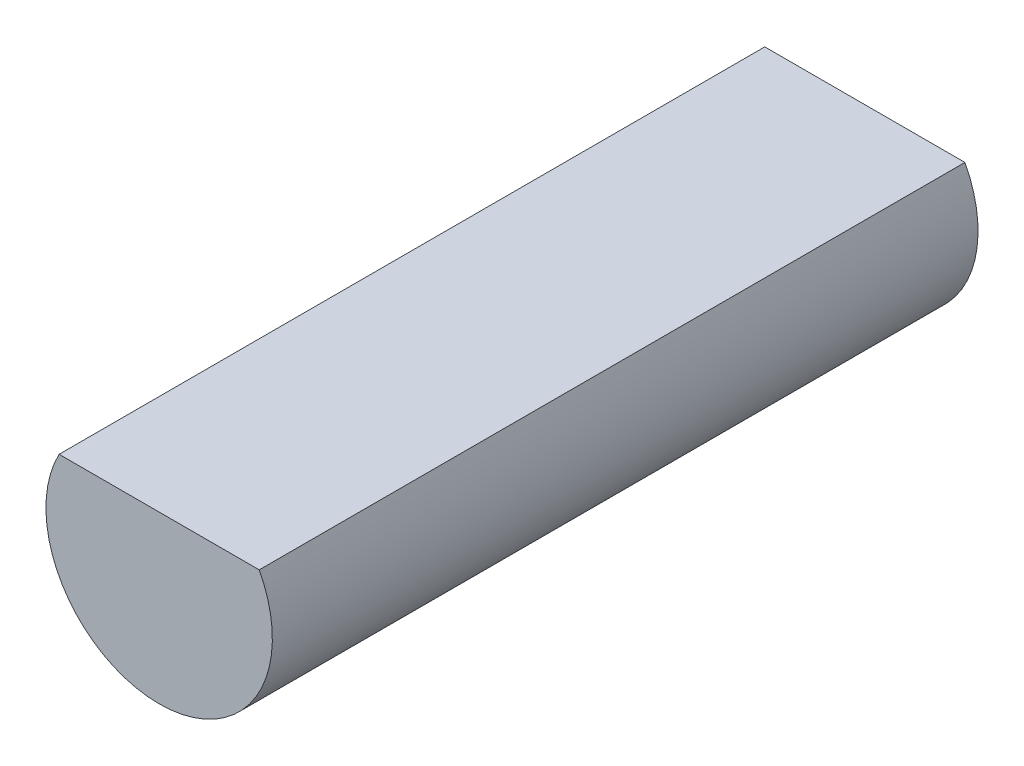
ISO-10303-21;
HEADER;
FILE_DESCRIPTION(('STEP AP214'),'2;1');
FILE_NAME('part.step','',(''),(''),'','','');
FILE_SCHEMA(('AUTOMOTIVE_DESIGN { 1 0 10303 214 1 1 1 1 }'));
ENDSEC;
DATA;
#1=APPLICATION_CONTEXT('core data for automotive mechanical design processes');
#2=APPLICATION_PROTOCOL_DEFINITION('international standard','automotive_design',2000,#1);
#3=PRODUCT_CONTEXT('',#1,'mechanical');
#4=PRODUCT('Part','Part','',(#3));
#5=PRODUCT_RELATED_PRODUCT_CATEGORY('part','',(#4));
#6=PRODUCT_DEFINITION_FORMATION('','',#4);
#7=PRODUCT_DEFINITION_CONTEXT('part definition',#1,'design');
#8=PRODUCT_DEFINITION('design','',#6,#7);
#9=PRODUCT_DEFINITION_SHAPE('','',#8);
#10=(LENGTH_UNIT() NAMED_UNIT(*) SI_UNIT(.MILLI.,.METRE.));
#11=(NAMED_UNIT(*) PLANE_ANGLE_UNIT() SI_UNIT($,.RADIAN.));
#12=(NAMED_UNIT(*) SI_UNIT($,.STERADIAN.) SOLID_ANGLE_UNIT());
#13=UNCERTAINTY_MEASURE_WITH_UNIT(LENGTH_MEASURE(1.E-05),#10,'distance_accuracy_value','');
#14=(GEOMETRIC_REPRESENTATION_CONTEXT(3) GLOBAL_UNCERTAINTY_ASSIGNED_CONTEXT((#13)) GLOBAL_UNIT_ASSIGNED_CONTEXT((#10,
#11,#12)) REPRESENTATION_CONTEXT('',''));
#15=CARTESIAN_POINT('',(0.,0.,0.));
#16=DIRECTION('',(0.,0.,1.));
#17=DIRECTION('',(1.,0.,0.));
#18=AXIS2_PLACEMENT_3D('',#15,#16,#17);
#19=CARTESIAN_POINT('',(0.,0.9,12.));
#20=DIRECTION('',(0.,1.,0.));
#21=DIRECTION('',(0.,0.,1.));
#22=AXIS2_PLACEMENT_3D('',#19,#20,#21);
#23=PLANE('',#22);
#24=DIRECTION('',(1.,0.,0.));
#25=VECTOR('',#24,1.);
#26=CARTESIAN_POINT('',(0.,0.9,0.));
#27=LINE('',#26,#25);
#28=CARTESIAN_POINT('',(-1.70165360752416,0.9,0.));
#29=VERTEX_POINT('',#28);
#30=CARTESIAN_POINT('',(1.70165360752416,0.9,0.));
#31=VERTEX_POINT('',#30);
#32=EDGE_CURVE('E70',#29,#31,#27,.T.);
#33=ORIENTED_EDGE('',*,*,#32,.F.);
#34=DIRECTION('',(0.,0.,-1.));
#35=VECTOR('',#34,1.);
#36=CARTESIAN_POINT('',(-1.70165360752416,0.9,12.));
#37=LINE('',#36,#35);
#38=CARTESIAN_POINT('',(-1.70165360752416,0.9,12.));
#39=VERTEX_POINT('',#38);
#40=EDGE_CURVE('E11',#39,#29,#37,.T.);
#41=ORIENTED_EDGE('',*,*,#40,.F.);
#42=DIRECTION('',(1.,0.,0.));
#43=VECTOR('',#42,1.);
#44=CARTESIAN_POINT('',(0.,0.9,12.));
#45=LINE('',#44,#43);
#46=CARTESIAN_POINT('',(1.70165360752416,0.9,12.));
#47=VERTEX_POINT('',#46);
#48=EDGE_CURVE('E71',#39,#47,#45,.T.);
#49=ORIENTED_EDGE('',*,*,#48,.T.);
#50=DIRECTION('',(0.,0.,-1.));
#51=VECTOR('',#50,1.);
#52=CARTESIAN_POINT('',(1.70165360752416,0.9,12.));
#53=LINE('',#52,#51);
#54=EDGE_CURVE('E50',#47,#31,#53,.T.);
#55=ORIENTED_EDGE('',*,*,#54,.T.);
#56=EDGE_LOOP('',(#33,#41,#49,#55));
#57=FACE_BOUND('',#56,.T.);
#58=ADVANCED_FACE('F41',(#57),#23,.T.);
#59=CARTESIAN_POINT('',(0.,0.,12.));
#60=DIRECTION('',(0.,0.,-1.));
#61=DIRECTION('',(-1.,0.,0.));
#62=AXIS2_PLACEMENT_3D('',#59,#60,#61);
#63=CYLINDRICAL_SURFACE('',#62,1.925);
#64=CARTESIAN_POINT('',(0.,0.,0.));
#65=DIRECTION('',(0.,0.,1.));
#66=DIRECTION('',(1.,0.,0.));
#67=AXIS2_PLACEMENT_3D('',#64,#65,#66);
#68=CIRCLE('',#67,1.925);
#69=EDGE_CURVE('E73',#29,#31,#68,.T.);
#70=ORIENTED_EDGE('',*,*,#69,.T.);
#71=ORIENTED_EDGE('',*,*,#54,.F.);
#72=CARTESIAN_POINT('',(0.,0.,12.));
#73=DIRECTION('',(0.,0.,1.));
#74=DIRECTION('',(1.,0.,0.));
#75=AXIS2_PLACEMENT_3D('',#72,#73,#74);
#76=CIRCLE('',#75,1.925);
#77=EDGE_CURVE('E57',#39,#47,#76,.T.);
#78=ORIENTED_EDGE('',*,*,#77,.F.);
#79=ORIENTED_EDGE('',*,*,#40,.T.);
#80=EDGE_LOOP('',(#70,#71,#78,#79));
#81=FACE_BOUND('',#80,.T.);
#82=ADVANCED_FACE('F74',(#81),#63,.T.);
#83=CARTESIAN_POINT('',(0.,0.,12.));
#84=DIRECTION('',(0.,0.,1.));
#85=DIRECTION('',(1.,0.,0.));
#86=AXIS2_PLACEMENT_3D('',#83,#84,#85);
#87=PLANE('',#86);
#88=ORIENTED_EDGE('',*,*,#48,.F.);
#89=ORIENTED_EDGE('',*,*,#77,.T.);
#90=EDGE_LOOP('',(#88,#89));
#91=FACE_BOUND('',#90,.T.);
#92=ADVANCED_FACE('F86',(#91),#87,.T.);
#93=CARTESIAN_POINT('',(0.,0.,0.));
#94=DIRECTION('',(0.,0.,1.));
#95=DIRECTION('',(1.,0.,0.));
#96=AXIS2_PLACEMENT_3D('',#93,#94,#95);
#97=PLANE('',#96);
#98=ORIENTED_EDGE('',*,*,#32,.T.);
#99=ORIENTED_EDGE('',*,*,#69,.F.);
#100=EDGE_LOOP('',(#98,#99));
#101=FACE_BOUND('',#100,.T.);
#102=ADVANCED_FACE('F78',(#101),#97,.F.);
#103=CLOSED_SHELL('',(#58,#82,#92,#102));
#104=MANIFOLD_SOLID_BREP('B2',#103);
#105=ADVANCED_BREP_SHAPE_REPRESENTATION('',(#18,#104),#14);
#106=SHAPE_DEFINITION_REPRESENTATION(#9,#105);
ENDSEC;
END-ISO-10303-21;
